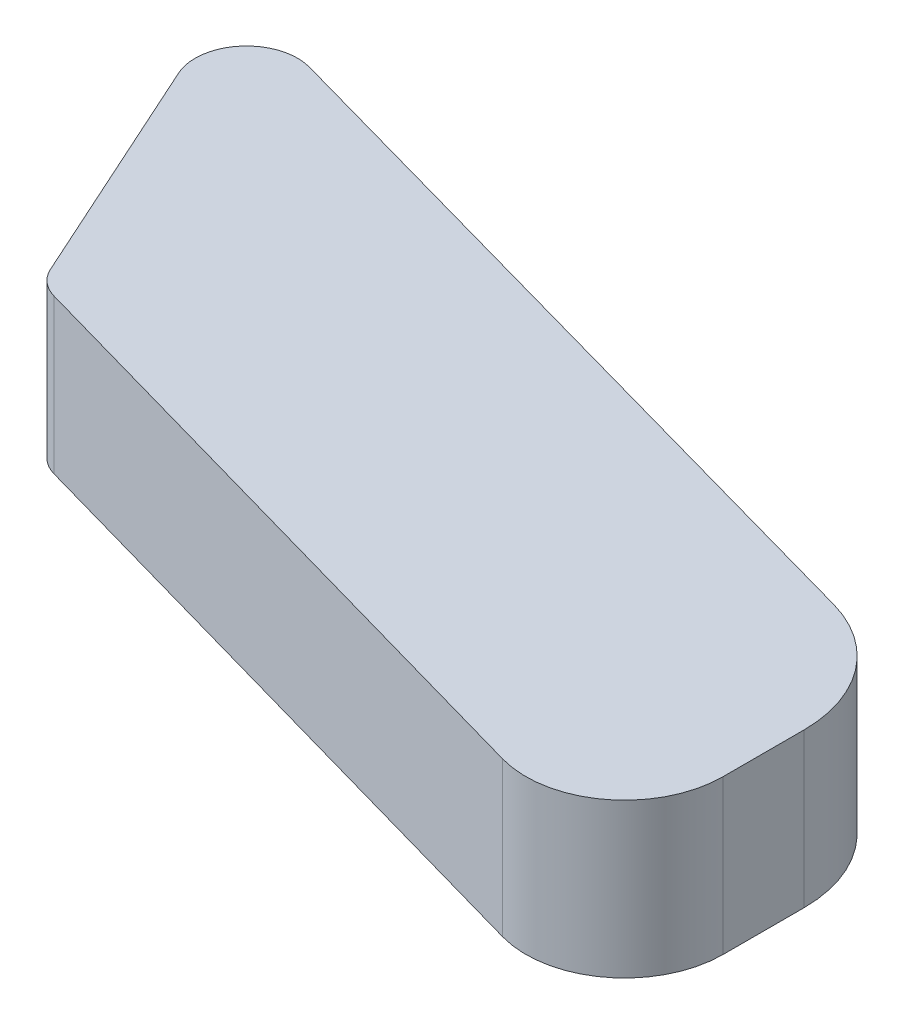
ISO-10303-21;
HEADER;
FILE_DESCRIPTION(('STEP AP214'),'2;1');
FILE_NAME('part.step','',(''),(''),'','','');
FILE_SCHEMA(('AUTOMOTIVE_DESIGN { 1 0 10303 214 1 1 1 1 }'));
ENDSEC;
DATA;
#1=APPLICATION_CONTEXT('core data for automotive mechanical design processes');
#2=APPLICATION_PROTOCOL_DEFINITION('international standard','automotive_design',2000,#1);
#3=PRODUCT_CONTEXT('',#1,'mechanical');
#4=PRODUCT('Part','Part','',(#3));
#5=PRODUCT_RELATED_PRODUCT_CATEGORY('part','',(#4));
#6=PRODUCT_DEFINITION_FORMATION('','',#4);
#7=PRODUCT_DEFINITION_CONTEXT('part definition',#1,'design');
#8=PRODUCT_DEFINITION('design','',#6,#7);
#9=PRODUCT_DEFINITION_SHAPE('','',#8);
#10=(LENGTH_UNIT() NAMED_UNIT(*) SI_UNIT(.MILLI.,.METRE.));
#11=(NAMED_UNIT(*) PLANE_ANGLE_UNIT() SI_UNIT($,.RADIAN.));
#12=(NAMED_UNIT(*) SI_UNIT($,.STERADIAN.) SOLID_ANGLE_UNIT());
#13=UNCERTAINTY_MEASURE_WITH_UNIT(LENGTH_MEASURE(1.E-05),#10,'distance_accuracy_value','');
#14=(GEOMETRIC_REPRESENTATION_CONTEXT(3) GLOBAL_UNCERTAINTY_ASSIGNED_CONTEXT((#13)) GLOBAL_UNIT_ASSIGNED_CONTEXT((#10,
#11,#12)) REPRESENTATION_CONTEXT('',''));
#15=CARTESIAN_POINT('',(0.,0.,0.));
#16=DIRECTION('',(0.,0.,1.));
#17=DIRECTION('',(1.,0.,0.));
#18=AXIS2_PLACEMENT_3D('',#15,#16,#17);
#19=CARTESIAN_POINT('',(0.149717935859949,2.9956,3.366868716425));
#20=DIRECTION('',(0.,-1.,0.));
#21=DIRECTION('',(-1.,0.,0.));
#22=AXIS2_PLACEMENT_3D('',#19,#20,#21);
#23=CYLINDRICAL_SURFACE('',#22,0.0216216216216138);
#24=CARTESIAN_POINT('',(0.149717935859949,2.9956,3.366868716425));
#25=DIRECTION('',(0.,1.,0.));
#26=DIRECTION('',(1.,0.,0.));
#27=AXIS2_PLACEMENT_3D('',#24,#25,#26);
#28=CIRCLE('',#27,0.0216216216216138);
#29=CARTESIAN_POINT('',(0.128096314238335,2.9956,3.366868716425));
#30=VERTEX_POINT('',#29);
#31=CARTESIAN_POINT('',(0.130018860801442,2.9956,3.3757816824514));
#32=VERTEX_POINT('',#31);
#33=EDGE_CURVE('E11',#30,#32,#28,.T.);
#34=ORIENTED_EDGE('',*,*,#33,.F.);
#35=DIRECTION('',(0.,-1.,0.));
#36=VECTOR('',#35,1.);
#37=CARTESIAN_POINT('',(0.128096314238335,2.9956,3.366868716425));
#38=LINE('',#37,#36);
#39=CARTESIAN_POINT('',(0.128096314238335,2.9306,3.366868716425));
#40=VERTEX_POINT('',#39);
#41=EDGE_CURVE('E24',#30,#40,#38,.T.);
#42=ORIENTED_EDGE('',*,*,#41,.T.);
#43=CARTESIAN_POINT('',(0.149717935859949,2.9306,3.366868716425));
#44=DIRECTION('',(0.,1.,0.));
#45=DIRECTION('',(1.,0.,0.));
#46=AXIS2_PLACEMENT_3D('',#43,#44,#45);
#47=CIRCLE('',#46,0.0216216216216138);
#48=CARTESIAN_POINT('',(0.130018860801442,2.9306,3.3757816824514));
#49=VERTEX_POINT('',#48);
#50=EDGE_CURVE('E157',#40,#49,#47,.T.);
#51=ORIENTED_EDGE('',*,*,#50,.T.);
#52=DIRECTION('',(0.,-1.,0.));
#53=VECTOR('',#52,1.);
#54=CARTESIAN_POINT('',(0.130018860801442,2.9956,3.3757816824514));
#55=LINE('',#54,#53);
#56=EDGE_CURVE('E154',#32,#49,#55,.T.);
#57=ORIENTED_EDGE('',*,*,#56,.F.);
#58=EDGE_LOOP('',(#34,#42,#51,#57));
#59=FACE_BOUND('',#58,.T.);
#60=ADVANCED_FACE('F17',(#59),#23,.T.);
#61=CARTESIAN_POINT('',(0.460422838557316,2.9956,3.5180412636034));
#62=DIRECTION('',(0.,-1.,0.));
#63=DIRECTION('',(-1.,0.,0.));
#64=AXIS2_PLACEMENT_3D('',#61,#62,#63);
#65=CYLINDRICAL_SURFACE('',#64,0.041621621621607);
#66=CARTESIAN_POINT('',(0.460422838557316,2.9306,3.5180412636034));
#67=DIRECTION('',(0.,1.,0.));
#68=DIRECTION('',(1.,0.,0.));
#69=AXIS2_PLACEMENT_3D('',#66,#67,#68);
#70=CIRCLE('',#69,0.041621621621607);
#71=CARTESIAN_POINT('',(0.449110063696537,2.9306,3.5580959825684));
#72=VERTEX_POINT('',#71);
#73=CARTESIAN_POINT('',(0.502044460110766,2.9306,3.5180388816547));
#74=VERTEX_POINT('',#73);
#75=EDGE_CURVE('E152',#72,#74,#70,.T.);
#76=ORIENTED_EDGE('',*,*,#75,.T.);
#77=DIRECTION('',(0.,-1.,0.));
#78=VECTOR('',#77,1.);
#79=CARTESIAN_POINT('',(0.502044460110766,2.9956,3.5180388816547));
#80=LINE('',#79,#78);
#81=CARTESIAN_POINT('',(0.502044460110766,2.9956,3.5180388816547));
#82=VERTEX_POINT('',#81);
#83=EDGE_CURVE('E149',#82,#74,#80,.T.);
#84=ORIENTED_EDGE('',*,*,#83,.F.);
#85=CARTESIAN_POINT('',(0.460422838557316,2.9956,3.5180412636034));
#86=DIRECTION('',(0.,1.,0.));
#87=DIRECTION('',(1.,0.,0.));
#88=AXIS2_PLACEMENT_3D('',#85,#86,#87);
#89=CIRCLE('',#88,0.041621621621607);
#90=CARTESIAN_POINT('',(0.449110063696537,2.9956,3.5580959825684));
#91=VERTEX_POINT('',#90);
#92=EDGE_CURVE('E147',#91,#82,#89,.T.);
#93=ORIENTED_EDGE('',*,*,#92,.F.);
#94=DIRECTION('',(0.,-1.,0.));
#95=VECTOR('',#94,1.);
#96=CARTESIAN_POINT('',(0.449110063696537,2.9956,3.5580959825684));
#97=LINE('',#96,#95);
#98=EDGE_CURVE('E107',#91,#72,#97,.T.);
#99=ORIENTED_EDGE('',*,*,#98,.T.);
#100=EDGE_LOOP('',(#76,#84,#93,#99));
#101=FACE_BOUND('',#100,.T.);
#102=ADVANCED_FACE('F179',(#101),#65,.T.);
#103=CARTESIAN_POINT('',(0.502044460110766,2.9956,3.5180388816547));
#104=DIRECTION('',(-0.999999998362442,0.,5.72286373709101E-05));
#105=DIRECTION('',(5.72286373709101E-05,0.,0.999999998362442));
#106=AXIS2_PLACEMENT_3D('',#103,#104,#105);
#107=PLANE('',#106);
#108=DIRECTION('',(-5.72286373709101E-05,0.,-0.999999998362441));
#109=VECTOR('',#108,1.);
#110=CARTESIAN_POINT('',(0.502044460110766,2.9306,3.5180388816547));
#111=LINE('',#110,#109);
#112=CARTESIAN_POINT('',(0.502042503467266,2.9306,3.4838489448209));
#113=VERTEX_POINT('',#112);
#114=EDGE_CURVE('E144',#74,#113,#111,.T.);
#115=ORIENTED_EDGE('',*,*,#114,.T.);
#116=DIRECTION('',(0.,-1.,0.));
#117=VECTOR('',#116,1.);
#118=CARTESIAN_POINT('',(0.502042503467266,2.9956,3.4838489448209));
#119=LINE('',#118,#117);
#120=CARTESIAN_POINT('',(0.502042503467266,2.9956,3.4838489448209));
#121=VERTEX_POINT('',#120);
#122=EDGE_CURVE('E141',#121,#113,#119,.T.);
#123=ORIENTED_EDGE('',*,*,#122,.F.);
#124=DIRECTION('',(-5.72286373709101E-05,0.,-0.999999998362441));
#125=VECTOR('',#124,1.);
#126=CARTESIAN_POINT('',(0.502044460110766,2.9956,3.5180388816547));
#127=LINE('',#126,#125);
#128=EDGE_CURVE('E138',#82,#121,#127,.T.);
#129=ORIENTED_EDGE('',*,*,#128,.F.);
#130=ORIENTED_EDGE('',*,*,#83,.T.);
#131=EDGE_LOOP('',(#115,#123,#129,#130));
#132=FACE_BOUND('',#131,.T.);
#133=ADVANCED_FACE('F177',(#132),#107,.F.);
#134=CARTESIAN_POINT('',(0.447988449501714,2.9956,3.4838520382608));
#135=DIRECTION('',(0.,-1.,0.));
#136=DIRECTION('',(-1.,0.,0.));
#137=AXIS2_PLACEMENT_3D('',#134,#135,#136);
#138=CYLINDRICAL_SURFACE('',#137,0.0540540540540672);
#139=CARTESIAN_POINT('',(0.447988449501714,2.9306,3.4838520382608));
#140=DIRECTION('',(0.,1.,0.));
#141=DIRECTION('',(1.,0.,0.));
#142=AXIS2_PLACEMENT_3D('',#139,#140,#141);
#143=CIRCLE('',#142,0.0540540540540672);
#144=CARTESIAN_POINT('',(0.462529665695284,2.9306,3.4317905957982));
#145=VERTEX_POINT('',#144);
#146=EDGE_CURVE('E136',#113,#145,#143,.T.);
#147=ORIENTED_EDGE('',*,*,#146,.T.);
#148=DIRECTION('',(0.,-1.,0.));
#149=VECTOR('',#148,1.);
#150=CARTESIAN_POINT('',(0.462529665695284,2.9956,3.4317905957982));
#151=LINE('',#150,#149);
#152=CARTESIAN_POINT('',(0.462529665695284,2.9956,3.4317905957982));
#153=VERTEX_POINT('',#152);
#154=EDGE_CURVE('E133',#153,#145,#151,.T.);
#155=ORIENTED_EDGE('',*,*,#154,.F.);
#156=CARTESIAN_POINT('',(0.447988449501714,2.9956,3.4838520382608));
#157=DIRECTION('',(0.,1.,0.));
#158=DIRECTION('',(1.,0.,0.));
#159=AXIS2_PLACEMENT_3D('',#156,#157,#158);
#160=CIRCLE('',#159,0.0540540540540672);
#161=EDGE_CURVE('E130',#121,#153,#160,.T.);
#162=ORIENTED_EDGE('',*,*,#161,.F.);
#163=ORIENTED_EDGE('',*,*,#122,.T.);
#164=EDGE_LOOP('',(#147,#155,#162,#163));
#165=FACE_BOUND('',#164,.T.);
#166=ADVANCED_FACE('F173',(#165),#138,.T.);
#167=CARTESIAN_POINT('',(0.462529665695283,2.9956,3.4317905957982));
#168=DIRECTION('',(-0.269012499581203,0.,0.963136685558739));
#169=DIRECTION('',(0.963136685558739,0.,0.269012499581203));
#170=AXIS2_PLACEMENT_3D('',#167,#168,#169);
#171=PLANE('',#170);
#172=DIRECTION('',(-0.963136685558739,0.,-0.269012499581203));
#173=VECTOR('',#172,1.);
#174=CARTESIAN_POINT('',(0.462529665695283,2.9306,3.4317905957982));
#175=LINE('',#174,#173);
#176=CARTESIAN_POINT('',(0.155534422337367,2.9306,3.3460441394399));
#177=VERTEX_POINT('',#176);
#178=EDGE_CURVE('E128',#145,#177,#175,.T.);
#179=ORIENTED_EDGE('',*,*,#178,.T.);
#180=DIRECTION('',(0.,-1.,0.));
#181=VECTOR('',#180,1.);
#182=CARTESIAN_POINT('',(0.155534422337367,2.9956,3.3460441394399));
#183=LINE('',#182,#181);
#184=CARTESIAN_POINT('',(0.155534422337367,2.9956,3.3460441394399));
#185=VERTEX_POINT('',#184);
#186=EDGE_CURVE('E125',#185,#177,#183,.T.);
#187=ORIENTED_EDGE('',*,*,#186,.F.);
#188=DIRECTION('',(-0.963136685558739,0.,-0.269012499581203));
#189=VECTOR('',#188,1.);
#190=CARTESIAN_POINT('',(0.462529665695283,2.9956,3.4317905957982));
#191=LINE('',#190,#189);
#192=EDGE_CURVE('E122',#153,#185,#191,.T.);
#193=ORIENTED_EDGE('',*,*,#192,.F.);
#194=ORIENTED_EDGE('',*,*,#154,.T.);
#195=EDGE_LOOP('',(#179,#187,#193,#194));
#196=FACE_BOUND('',#195,.T.);
#197=ADVANCED_FACE('F169',(#196),#171,.F.);
#198=CARTESIAN_POINT('',(0.149717935859949,2.9956,3.366868716425));
#199=DIRECTION('',(0.,-1.,0.));
#200=DIRECTION('',(-1.,0.,0.));
#201=AXIS2_PLACEMENT_3D('',#198,#199,#200);
#202=CYLINDRICAL_SURFACE('',#201,0.0216216216216138);
#203=ORIENTED_EDGE('',*,*,#41,.F.);
#204=CARTESIAN_POINT('',(0.149717935859949,2.9956,3.366868716425));
#205=DIRECTION('',(0.,1.,0.));
#206=DIRECTION('',(1.,0.,0.));
#207=AXIS2_PLACEMENT_3D('',#204,#205,#206);
#208=CIRCLE('',#207,0.0216216216216138);
#209=EDGE_CURVE('E120',#185,#30,#208,.T.);
#210=ORIENTED_EDGE('',*,*,#209,.F.);
#211=ORIENTED_EDGE('',*,*,#186,.T.);
#212=CARTESIAN_POINT('',(0.149717935859949,2.9306,3.366868716425));
#213=DIRECTION('',(0.,1.,0.));
#214=DIRECTION('',(1.,0.,0.));
#215=AXIS2_PLACEMENT_3D('',#212,#213,#214);
#216=CIRCLE('',#215,0.0216216216216138);
#217=EDGE_CURVE('E117',#177,#40,#216,.T.);
#218=ORIENTED_EDGE('',*,*,#217,.T.);
#219=EDGE_LOOP('',(#203,#210,#211,#218));
#220=FACE_BOUND('',#219,.T.);
#221=ADVANCED_FACE('F166',(#220),#202,.T.);
#222=CARTESIAN_POINT('',(0.130018860801441,2.9956,3.3757816824514));
#223=DIRECTION('',(0.911082221456577,0.,-0.41222467871993));
#224=DIRECTION('',(-0.41222467871993,0.,-0.911082221456577));
#225=AXIS2_PLACEMENT_3D('',#222,#223,#224);
#226=PLANE('',#225);
#227=DIRECTION('',(0.41222467871993,0.,0.911082221456577));
#228=VECTOR('',#227,1.);
#229=CARTESIAN_POINT('',(0.130018860801441,2.9306,3.3757816824514));
#230=LINE('',#229,#228);
#231=CARTESIAN_POINT('',(0.174734392825626,2.9306,3.4746101329379));
#232=VERTEX_POINT('',#231);
#233=EDGE_CURVE('E115',#49,#232,#230,.T.);
#234=ORIENTED_EDGE('',*,*,#233,.T.);
#235=DIRECTION('',(0.,-1.,0.));
#236=VECTOR('',#235,1.);
#237=CARTESIAN_POINT('',(0.174734392825626,2.9956,3.4746101329379));
#238=LINE('',#237,#236);
#239=CARTESIAN_POINT('',(0.174734392825626,2.9956,3.4746101329379));
#240=VERTEX_POINT('',#239);
#241=EDGE_CURVE('E113',#240,#232,#238,.T.);
#242=ORIENTED_EDGE('',*,*,#241,.F.);
#243=DIRECTION('',(0.41222467871993,0.,0.911082221456577));
#244=VECTOR('',#243,1.);
#245=CARTESIAN_POINT('',(0.130018860801441,2.9956,3.3757816824514));
#246=LINE('',#245,#244);
#247=EDGE_CURVE('E101',#32,#240,#246,.T.);
#248=ORIENTED_EDGE('',*,*,#247,.F.);
#249=ORIENTED_EDGE('',*,*,#56,.T.);
#250=EDGE_LOOP('',(#234,#242,#248,#249));
#251=FACE_BOUND('',#250,.T.);
#252=ADVANCED_FACE('F194',(#251),#226,.F.);
#253=CARTESIAN_POINT('',(0.189508699119489,2.9956,3.4679254084182));
#254=DIRECTION('',(0.,-1.,0.));
#255=DIRECTION('',(-1.,0.,0.));
#256=AXIS2_PLACEMENT_3D('',#253,#254,#255);
#257=CYLINDRICAL_SURFACE('',#256,0.016216216216188);
#258=CARTESIAN_POINT('',(0.189508699119489,2.9306,3.4679254084182));
#259=DIRECTION('',(0.,1.,0.));
#260=DIRECTION('',(1.,0.,0.));
#261=AXIS2_PLACEMENT_3D('',#258,#259,#260);
#262=CIRCLE('',#261,0.016216216216188);
#263=CARTESIAN_POINT('',(0.185101124498415,2.9306,3.4835311430798));
#264=VERTEX_POINT('',#263);
#265=EDGE_CURVE('E90',#232,#264,#262,.T.);
#266=ORIENTED_EDGE('',*,*,#265,.T.);
#267=DIRECTION('',(0.,-1.,0.));
#268=VECTOR('',#267,1.);
#269=CARTESIAN_POINT('',(0.185101124498415,2.9956,3.4835311430798));
#270=LINE('',#269,#268);
#271=CARTESIAN_POINT('',(0.185101124498415,2.9956,3.4835311430798));
#272=VERTEX_POINT('',#271);
#273=EDGE_CURVE('E84',#272,#264,#270,.T.);
#274=ORIENTED_EDGE('',*,*,#273,.F.);
#275=CARTESIAN_POINT('',(0.189508699119489,2.9956,3.4679254084182));
#276=DIRECTION('',(0.,1.,0.));
#277=DIRECTION('',(1.,0.,0.));
#278=AXIS2_PLACEMENT_3D('',#275,#276,#277);
#279=CIRCLE('',#278,0.016216216216188);
#280=EDGE_CURVE('E88',#240,#272,#279,.T.);
#281=ORIENTED_EDGE('',*,*,#280,.F.);
#282=ORIENTED_EDGE('',*,*,#241,.T.);
#283=EDGE_LOOP('',(#266,#274,#281,#282));
#284=FACE_BOUND('',#283,.T.);
#285=ADVANCED_FACE('F86',(#284),#257,.T.);
#286=CARTESIAN_POINT('',(0.185101124498415,2.9956,3.4835311430798));
#287=DIRECTION('',(0.2718004349669,0.,-0.962353637470033));
#288=DIRECTION('',(-0.962353637470033,0.,-0.2718004349669));
#289=AXIS2_PLACEMENT_3D('',#286,#287,#288);
#290=PLANE('',#289);
#291=DIRECTION('',(0.962353637470033,0.,0.2718004349669));
#292=VECTOR('',#291,1.);
#293=CARTESIAN_POINT('',(0.185101124498415,2.9306,3.4835311430798));
#294=LINE('',#293,#292);
#295=EDGE_CURVE('E102',#264,#72,#294,.T.);
#296=ORIENTED_EDGE('',*,*,#295,.T.);
#297=ORIENTED_EDGE('',*,*,#98,.F.);
#298=DIRECTION('',(0.962353637470033,0.,0.2718004349669));
#299=VECTOR('',#298,1.);
#300=CARTESIAN_POINT('',(0.185101124498415,2.9956,3.4835311430798));
#301=LINE('',#300,#299);
#302=EDGE_CURVE('E99',#272,#91,#301,.T.);
#303=ORIENTED_EDGE('',*,*,#302,.F.);
#304=ORIENTED_EDGE('',*,*,#273,.T.);
#305=EDGE_LOOP('',(#296,#297,#303,#304));
#306=FACE_BOUND('',#305,.T.);
#307=ADVANCED_FACE('F105',(#306),#290,.F.);
#308=CARTESIAN_POINT('',(0.460422838557316,2.9956,3.5180412636034));
#309=DIRECTION('',(0.,1.,0.));
#310=DIRECTION('',(1.,0.,0.));
#311=AXIS2_PLACEMENT_3D('',#308,#309,#310);
#312=PLANE('',#311);
#313=ORIENTED_EDGE('',*,*,#92,.T.);
#314=ORIENTED_EDGE('',*,*,#128,.T.);
#315=ORIENTED_EDGE('',*,*,#161,.T.);
#316=ORIENTED_EDGE('',*,*,#192,.T.);
#317=ORIENTED_EDGE('',*,*,#209,.T.);
#318=ORIENTED_EDGE('',*,*,#33,.T.);
#319=ORIENTED_EDGE('',*,*,#247,.T.);
#320=ORIENTED_EDGE('',*,*,#280,.T.);
#321=ORIENTED_EDGE('',*,*,#302,.T.);
#322=EDGE_LOOP('',(#313,#314,#315,#316,#317,#318,#319,#320,#321));
#323=FACE_BOUND('',#322,.T.);
#324=ADVANCED_FACE('F98',(#323),#312,.T.);
#325=CARTESIAN_POINT('',(0.460422838557316,2.9306,3.5180412636034));
#326=DIRECTION('',(0.,1.,0.));
#327=DIRECTION('',(1.,0.,0.));
#328=AXIS2_PLACEMENT_3D('',#325,#326,#327);
#329=PLANE('',#328);
#330=ORIENTED_EDGE('',*,*,#75,.F.);
#331=ORIENTED_EDGE('',*,*,#295,.F.);
#332=ORIENTED_EDGE('',*,*,#265,.F.);
#333=ORIENTED_EDGE('',*,*,#233,.F.);
#334=ORIENTED_EDGE('',*,*,#50,.F.);
#335=ORIENTED_EDGE('',*,*,#217,.F.);
#336=ORIENTED_EDGE('',*,*,#178,.F.);
#337=ORIENTED_EDGE('',*,*,#146,.F.);
#338=ORIENTED_EDGE('',*,*,#114,.F.);
#339=EDGE_LOOP('',(#330,#331,#332,#333,#334,#335,#336,#337,#338));
#340=FACE_BOUND('',#339,.T.);
#341=ADVANCED_FACE('F164',(#340),#329,.F.);
#342=CLOSED_SHELL('',(#60,#102,#133,#166,#197,#221,#252,#285,#307,#324,#341));
#343=MANIFOLD_SOLID_BREP('B1',#342);
#344=ADVANCED_BREP_SHAPE_REPRESENTATION('',(#18,#343),#14);
#345=SHAPE_DEFINITION_REPRESENTATION(#9,#344);
ENDSEC;
END-ISO-10303-21;
